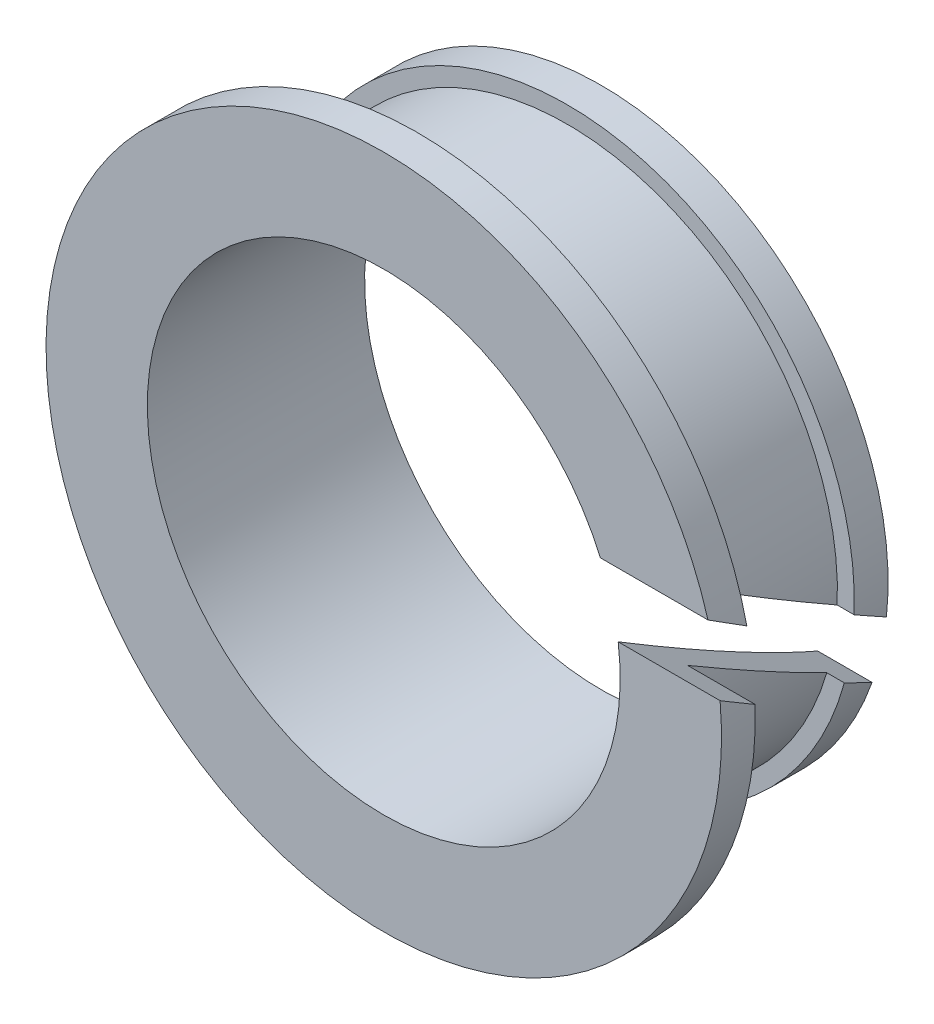
ISO-10303-21;
HEADER;
FILE_DESCRIPTION(('STEP AP214'),'2;1');
FILE_NAME('part.step','',(''),(''),'','','');
FILE_SCHEMA(('AUTOMOTIVE_DESIGN { 1 0 10303 214 1 1 1 1 }'));
ENDSEC;
DATA;
#1=APPLICATION_CONTEXT('core data for automotive mechanical design processes');
#2=APPLICATION_PROTOCOL_DEFINITION('international standard','automotive_design',2000,#1);
#3=PRODUCT_CONTEXT('',#1,'mechanical');
#4=PRODUCT('Part','Part','',(#3));
#5=PRODUCT_RELATED_PRODUCT_CATEGORY('part','',(#4));
#6=PRODUCT_DEFINITION_FORMATION('','',#4);
#7=PRODUCT_DEFINITION_CONTEXT('part definition',#1,'design');
#8=PRODUCT_DEFINITION('design','',#6,#7);
#9=PRODUCT_DEFINITION_SHAPE('','',#8);
#10=(LENGTH_UNIT() NAMED_UNIT(*) SI_UNIT(.MILLI.,.METRE.));
#11=(NAMED_UNIT(*) PLANE_ANGLE_UNIT() SI_UNIT($,.RADIAN.));
#12=(NAMED_UNIT(*) SI_UNIT($,.STERADIAN.) SOLID_ANGLE_UNIT());
#13=UNCERTAINTY_MEASURE_WITH_UNIT(LENGTH_MEASURE(1.E-05),#10,'distance_accuracy_value','');
#14=(GEOMETRIC_REPRESENTATION_CONTEXT(3) GLOBAL_UNCERTAINTY_ASSIGNED_CONTEXT((#13)) GLOBAL_UNIT_ASSIGNED_CONTEXT((#10,
#11,#12)) REPRESENTATION_CONTEXT('',''));
#15=CARTESIAN_POINT('',(0.,0.,0.));
#16=DIRECTION('',(0.,0.,1.));
#17=DIRECTION('',(1.,0.,0.));
#18=AXIS2_PLACEMENT_3D('',#15,#16,#17);
#19=CARTESIAN_POINT('',(0.,7.9375,2.5527));
#20=DIRECTION('',(0.,0.,-1.));
#21=DIRECTION('',(-1.,0.,0.));
#22=AXIS2_PLACEMENT_3D('',#19,#20,#21);
#23=PLANE('',#22);
#24=DIRECTION('',(-1.,0.,0.));
#25=VECTOR('',#24,1.);
#26=CARTESIAN_POINT('',(7.9375,0.723802032160374,2.5527));
#27=LINE('',#26,#25);
#28=CARTESIAN_POINT('',(7.90443020515967,0.723802032160374,2.5527));
#29=VERTEX_POINT('',#28);
#30=CARTESIAN_POINT('',(5.50890412702386,0.723802032160374,2.5527));
#31=VERTEX_POINT('',#30);
#32=EDGE_CURVE('E59',#29,#31,#27,.T.);
#33=ORIENTED_EDGE('',*,*,#32,.T.);
#34=CARTESIAN_POINT('',(0.,0.,2.5527));
#35=DIRECTION('',(0.,0.,1.));
#36=DIRECTION('',(1.,0.,0.));
#37=AXIS2_PLACEMENT_3D('',#34,#35,#36);
#38=CIRCLE('',#37,5.55625);
#39=CARTESIAN_POINT('',(5.09181878941694,2.22380203216037,2.5527));
#40=VERTEX_POINT('',#39);
#41=EDGE_CURVE('E114',#40,#31,#38,.T.);
#42=ORIENTED_EDGE('',*,*,#41,.F.);
#43=DIRECTION('',(-1.,0.,0.));
#44=VECTOR('',#43,1.);
#45=CARTESIAN_POINT('',(7.9375,2.22380203216037,2.5527));
#46=LINE('',#45,#44);
#47=CARTESIAN_POINT('',(7.61962011991145,2.22380203216037,2.5527));
#48=VERTEX_POINT('',#47);
#49=EDGE_CURVE('E116',#48,#40,#46,.T.);
#50=ORIENTED_EDGE('',*,*,#49,.F.);
#51=CARTESIAN_POINT('',(0.,0.,2.5527));
#52=DIRECTION('',(0.,0.,1.));
#53=DIRECTION('',(1.,0.,0.));
#54=AXIS2_PLACEMENT_3D('',#51,#52,#53);
#55=CIRCLE('',#54,7.9375);
#56=EDGE_CURVE('E107',#48,#29,#55,.T.);
#57=ORIENTED_EDGE('',*,*,#56,.T.);
#58=EDGE_LOOP('',(#33,#42,#50,#57));
#59=FACE_BOUND('',#58,.T.);
#60=ADVANCED_FACE('F38',(#59),#23,.F.);
#61=CARTESIAN_POINT('',(0.,0.,22.5136363636364));
#62=DIRECTION('',(0.,0.,1.));
#63=DIRECTION('',(1.,0.,0.));
#64=AXIS2_PLACEMENT_3D('',#61,#62,#63);
#65=CYLINDRICAL_SURFACE('',#64,5.55625);
#66=CARTESIAN_POINT('',(0.,0.,1.29903810567664));
#67=DIRECTION('',(0.,0.866025403784436,-0.500000000000004));
#68=DIRECTION('',(0.,0.500000000000004,0.866025403784436));
#69=AXIS2_PLACEMENT_3D('',#66,#67,#68);
#70=ELLIPSE('',#69,11.1124999999999,5.55625);
#71=CARTESIAN_POINT('',(5.09181878941694,-2.22380203216037,-2.5527));
#72=VERTEX_POINT('',#71);
#73=EDGE_CURVE('E99',#72,#31,#70,.F.);
#74=ORIENTED_EDGE('',*,*,#73,.F.);
#75=CARTESIAN_POINT('',(0.,0.,-2.5527));
#76=DIRECTION('',(0.,0.,1.));
#77=DIRECTION('',(1.,0.,0.));
#78=AXIS2_PLACEMENT_3D('',#75,#76,#77);
#79=CIRCLE('',#78,5.55625);
#80=CARTESIAN_POINT('',(5.50890412702386,-0.723802032160374,-2.5527));
#81=VERTEX_POINT('',#80);
#82=EDGE_CURVE('E121',#81,#72,#79,.T.);
#83=ORIENTED_EDGE('',*,*,#82,.F.);
#84=CARTESIAN_POINT('',(0.,0.,-1.29903810567664));
#85=DIRECTION('',(0.,-0.866025403784436,0.500000000000004));
#86=DIRECTION('',(0.,0.500000000000004,0.866025403784436));
#87=AXIS2_PLACEMENT_3D('',#84,#85,#86);
#88=ELLIPSE('',#87,11.1124999999999,5.55625);
#89=EDGE_CURVE('E120',#40,#81,#88,.F.);
#90=ORIENTED_EDGE('',*,*,#89,.F.);
#91=ORIENTED_EDGE('',*,*,#41,.T.);
#92=EDGE_LOOP('',(#74,#83,#90,#91));
#93=FACE_BOUND('',#92,.T.);
#94=ADVANCED_FACE('F119',(#93),#65,.F.);
#95=CARTESIAN_POINT('',(0.,5.55625,-2.5527));
#96=DIRECTION('',(0.,0.,1.));
#97=DIRECTION('',(1.,0.,0.));
#98=AXIS2_PLACEMENT_3D('',#95,#96,#97);
#99=PLANE('',#98);
#100=DIRECTION('',(-1.,0.,0.));
#101=VECTOR('',#100,1.);
#102=CARTESIAN_POINT('',(7.9375,-2.22380203216037,-2.5527));
#103=LINE('',#102,#101);
#104=CARTESIAN_POINT('',(6.36985296434575,-2.22380203216037,-2.5527));
#105=VERTEX_POINT('',#104);
#106=EDGE_CURVE('E102',#105,#72,#103,.T.);
#107=ORIENTED_EDGE('',*,*,#106,.F.);
#108=CARTESIAN_POINT('',(0.,0.,-2.5527));
#109=DIRECTION('',(0.,0.,1.));
#110=DIRECTION('',(1.,0.,0.));
#111=AXIS2_PLACEMENT_3D('',#108,#109,#110);
#112=CIRCLE('',#111,6.746875);
#113=CARTESIAN_POINT('',(6.70793805009151,-0.723802032160374,-2.5527));
#114=VERTEX_POINT('',#113);
#115=EDGE_CURVE('E123',#114,#105,#112,.T.);
#116=ORIENTED_EDGE('',*,*,#115,.F.);
#117=DIRECTION('',(-1.,0.,0.));
#118=VECTOR('',#117,1.);
#119=CARTESIAN_POINT('',(7.9375,-0.723802032160374,-2.5527));
#120=LINE('',#119,#118);
#121=EDGE_CURVE('E157',#114,#81,#120,.T.);
#122=ORIENTED_EDGE('',*,*,#121,.T.);
#123=ORIENTED_EDGE('',*,*,#82,.T.);
#124=EDGE_LOOP('',(#107,#116,#122,#123));
#125=FACE_BOUND('',#124,.T.);
#126=ADVANCED_FACE('F184',(#125),#99,.F.);
#127=CARTESIAN_POINT('',(0.,0.,22.5136363636364));
#128=DIRECTION('',(0.,0.,1.));
#129=DIRECTION('',(1.,0.,0.));
#130=AXIS2_PLACEMENT_3D('',#127,#128,#129);
#131=CYLINDRICAL_SURFACE('',#130,6.746875);
#132=CARTESIAN_POINT('',(0.,0.,1.29903810567664));
#133=DIRECTION('',(0.,0.866025403784436,-0.500000000000004));
#134=DIRECTION('',(0.,0.500000000000004,0.866025403784436));
#135=AXIS2_PLACEMENT_3D('',#132,#133,#134);
#136=ELLIPSE('',#135,13.4937499999999,6.746875);
#137=CARTESIAN_POINT('',(6.51177588533304,-1.7655302559911,-1.75895));
#138=VERTEX_POINT('',#137);
#139=EDGE_CURVE('E108',#138,#105,#136,.T.);
#140=ORIENTED_EDGE('',*,*,#139,.F.);
#141=CARTESIAN_POINT('',(0.,0.,-1.75895));
#142=DIRECTION('',(0.,0.,1.));
#143=DIRECTION('',(1.,0.,0.));
#144=AXIS2_PLACEMENT_3D('',#141,#142,#143);
#145=CIRCLE('',#144,6.746875);
#146=CARTESIAN_POINT('',(6.741647865973,-0.265530255991104,-1.75895));
#147=VERTEX_POINT('',#146);
#148=EDGE_CURVE('E128',#147,#138,#145,.T.);
#149=ORIENTED_EDGE('',*,*,#148,.F.);
#150=CARTESIAN_POINT('',(0.,0.,-1.29903810567664));
#151=DIRECTION('',(0.,-0.866025403784436,0.500000000000004));
#152=DIRECTION('',(0.,0.500000000000004,0.866025403784436));
#153=AXIS2_PLACEMENT_3D('',#150,#151,#152);
#154=ELLIPSE('',#153,13.4937499999999,6.746875);
#155=EDGE_CURVE('E149',#114,#147,#154,.T.);
#156=ORIENTED_EDGE('',*,*,#155,.F.);
#157=ORIENTED_EDGE('',*,*,#115,.T.);
#158=EDGE_LOOP('',(#140,#149,#156,#157));
#159=FACE_BOUND('',#158,.T.);
#160=ADVANCED_FACE('F181',(#159),#131,.T.);
#161=CARTESIAN_POINT('',(0.,6.746875,-1.75895));
#162=DIRECTION('',(0.,0.,-1.));
#163=DIRECTION('',(-1.,0.,0.));
#164=AXIS2_PLACEMENT_3D('',#161,#162,#163);
#165=PLANE('',#164);
#166=DIRECTION('',(1.,0.,0.));
#167=VECTOR('',#166,1.);
#168=CARTESIAN_POINT('',(0.,-1.7655302559911,-1.75895));
#169=LINE('',#168,#167);
#170=CARTESIAN_POINT('',(6.09962317812994,-1.7655302559911,-1.75895));
#171=VERTEX_POINT('',#170);
#172=EDGE_CURVE('E142',#171,#138,#169,.T.);
#173=ORIENTED_EDGE('',*,*,#172,.F.);
#174=CARTESIAN_POINT('',(0.,0.,-1.75895));
#175=DIRECTION('',(0.,0.,1.));
#176=DIRECTION('',(1.,0.,0.));
#177=AXIS2_PLACEMENT_3D('',#174,#175,#176);
#178=CIRCLE('',#177,6.35);
#179=CARTESIAN_POINT('',(6.3444458925231,-0.265530255991105,-1.75895));
#180=VERTEX_POINT('',#179);
#181=EDGE_CURVE('E131',#180,#171,#178,.T.);
#182=ORIENTED_EDGE('',*,*,#181,.F.);
#183=DIRECTION('',(-1.,0.,0.));
#184=VECTOR('',#183,1.);
#185=CARTESIAN_POINT('',(0.,-0.265530255991104,-1.75895));
#186=LINE('',#185,#184);
#187=EDGE_CURVE('E151',#147,#180,#186,.T.);
#188=ORIENTED_EDGE('',*,*,#187,.F.);
#189=ORIENTED_EDGE('',*,*,#148,.T.);
#190=EDGE_LOOP('',(#173,#182,#188,#189));
#191=FACE_BOUND('',#190,.T.);
#192=ADVANCED_FACE('F176',(#191),#165,.F.);
#193=CARTESIAN_POINT('',(0.,0.,22.5136363636364));
#194=DIRECTION('',(0.,0.,1.));
#195=DIRECTION('',(1.,0.,0.));
#196=AXIS2_PLACEMENT_3D('',#193,#194,#195);
#197=CYLINDRICAL_SURFACE('',#196,6.35);
#198=CARTESIAN_POINT('',(0.,0.,1.29903810567664));
#199=DIRECTION('',(0.,0.866025403784436,-0.500000000000004));
#200=DIRECTION('',(0.,0.500000000000004,0.866025403784436));
#201=AXIS2_PLACEMENT_3D('',#198,#199,#200);
#202=ELLIPSE('',#201,12.6999999999999,6.35);
#203=CARTESIAN_POINT('',(6.3444458925231,0.265530255991105,1.75895000000001));
#204=VERTEX_POINT('',#203);
#205=EDGE_CURVE('E144',#204,#171,#202,.T.);
#206=ORIENTED_EDGE('',*,*,#205,.F.);
#207=CARTESIAN_POINT('',(0.,0.,1.75895000000001));
#208=DIRECTION('',(0.,0.,1.));
#209=DIRECTION('',(1.,0.,0.));
#210=AXIS2_PLACEMENT_3D('',#207,#208,#209);
#211=CIRCLE('',#210,6.35);
#212=CARTESIAN_POINT('',(6.09962317812994,1.76553025599111,1.75895000000001));
#213=VERTEX_POINT('',#212);
#214=EDGE_CURVE('E134',#213,#204,#211,.T.);
#215=ORIENTED_EDGE('',*,*,#214,.F.);
#216=CARTESIAN_POINT('',(0.,0.,-1.29903810567664));
#217=DIRECTION('',(0.,-0.866025403784436,0.500000000000004));
#218=DIRECTION('',(0.,0.500000000000004,0.866025403784436));
#219=AXIS2_PLACEMENT_3D('',#216,#217,#218);
#220=ELLIPSE('',#219,12.6999999999999,6.35);
#221=EDGE_CURVE('E153',#180,#213,#220,.T.);
#222=ORIENTED_EDGE('',*,*,#221,.F.);
#223=ORIENTED_EDGE('',*,*,#181,.T.);
#224=EDGE_LOOP('',(#206,#215,#222,#223));
#225=FACE_BOUND('',#224,.T.);
#226=ADVANCED_FACE('F171',(#225),#197,.T.);
#227=CARTESIAN_POINT('',(0.,6.35,1.75895));
#228=DIRECTION('',(0.,0.,1.));
#229=DIRECTION('',(1.,0.,0.));
#230=AXIS2_PLACEMENT_3D('',#227,#228,#229);
#231=PLANE('',#230);
#232=DIRECTION('',(-1.,0.,0.));
#233=VECTOR('',#232,1.);
#234=CARTESIAN_POINT('',(0.,0.265530255991105,1.75895));
#235=LINE('',#234,#233);
#236=CARTESIAN_POINT('',(7.93305741395796,0.265530255991105,1.75895));
#237=VERTEX_POINT('',#236);
#238=EDGE_CURVE('E146',#237,#204,#235,.T.);
#239=ORIENTED_EDGE('',*,*,#238,.F.);
#240=CARTESIAN_POINT('',(0.,0.,1.75895));
#241=DIRECTION('',(0.,0.,1.));
#242=DIRECTION('',(1.,0.,0.));
#243=AXIS2_PLACEMENT_3D('',#240,#241,#242);
#244=CIRCLE('',#243,7.9375);
#245=CARTESIAN_POINT('',(7.73865680626684,1.7655302559911,1.75895));
#246=VERTEX_POINT('',#245);
#247=EDGE_CURVE('E137',#246,#237,#244,.T.);
#248=ORIENTED_EDGE('',*,*,#247,.F.);
#249=DIRECTION('',(1.,0.,0.));
#250=VECTOR('',#249,1.);
#251=CARTESIAN_POINT('',(0.,1.76553025599111,1.75895));
#252=LINE('',#251,#250);
#253=EDGE_CURVE('E52',#213,#246,#252,.T.);
#254=ORIENTED_EDGE('',*,*,#253,.F.);
#255=ORIENTED_EDGE('',*,*,#214,.T.);
#256=EDGE_LOOP('',(#239,#248,#254,#255));
#257=FACE_BOUND('',#256,.T.);
#258=ADVANCED_FACE('F167',(#257),#231,.F.);
#259=CARTESIAN_POINT('',(0.,0.,22.5136363636364));
#260=DIRECTION('',(0.,0.,1.));
#261=DIRECTION('',(1.,0.,0.));
#262=AXIS2_PLACEMENT_3D('',#259,#260,#261);
#263=CYLINDRICAL_SURFACE('',#262,7.9375);
#264=CARTESIAN_POINT('',(0.,0.,1.29903810567664));
#265=DIRECTION('',(0.,0.866025403784436,-0.500000000000004));
#266=DIRECTION('',(0.,0.500000000000004,0.866025403784436));
#267=AXIS2_PLACEMENT_3D('',#264,#265,#266);
#268=ELLIPSE('',#267,15.8749999999999,7.9375);
#269=EDGE_CURVE('E11',#29,#237,#268,.T.);
#270=ORIENTED_EDGE('',*,*,#269,.F.);
#271=ORIENTED_EDGE('',*,*,#56,.F.);
#272=CARTESIAN_POINT('',(0.,0.,-1.29903810567664));
#273=DIRECTION('',(0.,-0.866025403784436,0.500000000000004));
#274=DIRECTION('',(0.,0.500000000000004,0.866025403784436));
#275=AXIS2_PLACEMENT_3D('',#272,#273,#274);
#276=ELLIPSE('',#275,15.8749999999999,7.9375);
#277=EDGE_CURVE('E45',#246,#48,#276,.T.);
#278=ORIENTED_EDGE('',*,*,#277,.F.);
#279=ORIENTED_EDGE('',*,*,#247,.T.);
#280=EDGE_LOOP('',(#270,#271,#278,#279));
#281=FACE_BOUND('',#280,.T.);
#282=ADVANCED_FACE('F162',(#281),#263,.T.);
#283=CARTESIAN_POINT('',(7.9375,2.22380203216037,2.5527));
#284=DIRECTION('',(0.,-0.866025403784436,0.500000000000004));
#285=DIRECTION('',(0.,-0.500000000000004,-0.866025403784436));
#286=AXIS2_PLACEMENT_3D('',#283,#284,#285);
#287=PLANE('',#286);
#288=ORIENTED_EDGE('',*,*,#89,.T.);
#289=ORIENTED_EDGE('',*,*,#121,.F.);
#290=ORIENTED_EDGE('',*,*,#155,.T.);
#291=ORIENTED_EDGE('',*,*,#187,.T.);
#292=ORIENTED_EDGE('',*,*,#221,.T.);
#293=ORIENTED_EDGE('',*,*,#253,.T.);
#294=ORIENTED_EDGE('',*,*,#277,.T.);
#295=ORIENTED_EDGE('',*,*,#49,.T.);
#296=EDGE_LOOP('',(#288,#289,#290,#291,#292,#293,#294,#295));
#297=FACE_BOUND('',#296,.T.);
#298=ADVANCED_FACE('F160',(#297),#287,.T.);
#299=CARTESIAN_POINT('',(7.9375,-2.22380203216037,-2.5527));
#300=DIRECTION('',(0.,0.866025403784436,-0.500000000000004));
#301=DIRECTION('',(0.,0.500000000000004,0.866025403784436));
#302=AXIS2_PLACEMENT_3D('',#299,#300,#301);
#303=PLANE('',#302);
#304=ORIENTED_EDGE('',*,*,#73,.T.);
#305=ORIENTED_EDGE('',*,*,#32,.F.);
#306=ORIENTED_EDGE('',*,*,#269,.T.);
#307=ORIENTED_EDGE('',*,*,#238,.T.);
#308=ORIENTED_EDGE('',*,*,#205,.T.);
#309=ORIENTED_EDGE('',*,*,#172,.T.);
#310=ORIENTED_EDGE('',*,*,#139,.T.);
#311=ORIENTED_EDGE('',*,*,#106,.T.);
#312=EDGE_LOOP('',(#304,#305,#306,#307,#308,#309,#310,#311));
#313=FACE_BOUND('',#312,.T.);
#314=ADVANCED_FACE('F100',(#313),#303,.T.);
#315=CLOSED_SHELL('',(#60,#94,#126,#160,#192,#226,#258,#282,#298,#314));
#316=MANIFOLD_SOLID_BREP('B2',#315);
#317=ADVANCED_BREP_SHAPE_REPRESENTATION('',(#18,#316),#14);
#318=SHAPE_DEFINITION_REPRESENTATION(#9,#317);
ENDSEC;
END-ISO-10303-21;
